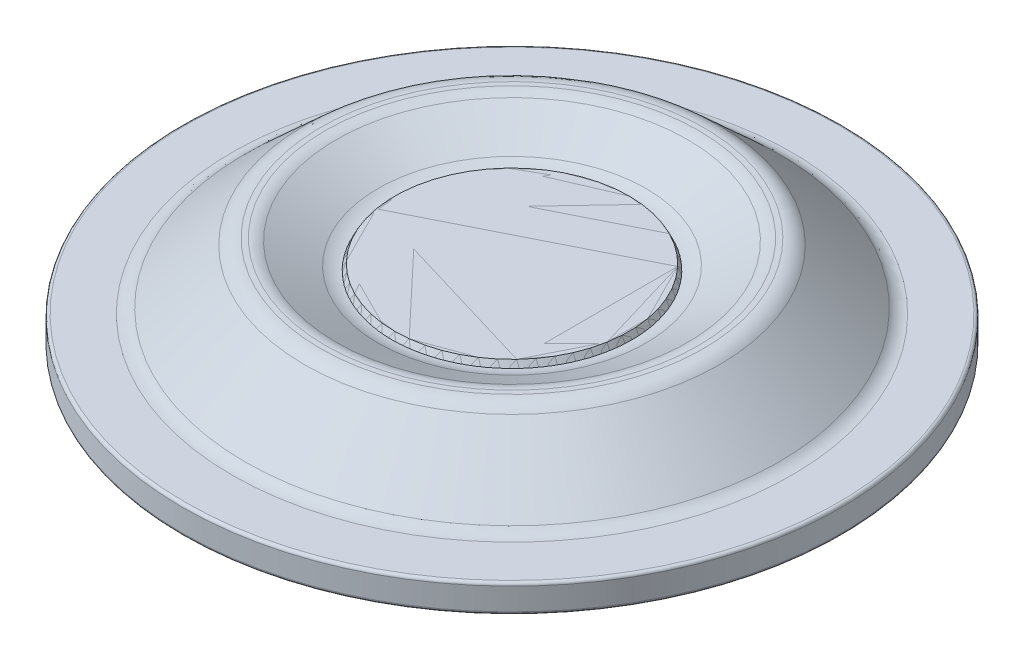
ISO-10303-21;
HEADER;
FILE_DESCRIPTION(('STEP AP214'),'2;1');
FILE_NAME('part.step','',(''),(''),'','','');
FILE_SCHEMA(('AUTOMOTIVE_DESIGN { 1 0 10303 214 1 1 1 1 }'));
ENDSEC;
DATA;
#1=APPLICATION_CONTEXT('core data for automotive mechanical design processes');
#2=APPLICATION_PROTOCOL_DEFINITION('international standard','automotive_design',2000,#1);
#3=PRODUCT_CONTEXT('',#1,'mechanical');
#4=PRODUCT('Part','Part','',(#3));
#5=PRODUCT_RELATED_PRODUCT_CATEGORY('part','',(#4));
#6=PRODUCT_DEFINITION_FORMATION('','',#4);
#7=PRODUCT_DEFINITION_CONTEXT('part definition',#1,'design');
#8=PRODUCT_DEFINITION('design','',#6,#7);
#9=PRODUCT_DEFINITION_SHAPE('','',#8);
#10=(LENGTH_UNIT() NAMED_UNIT(*) SI_UNIT(.MILLI.,.METRE.));
#11=(NAMED_UNIT(*) PLANE_ANGLE_UNIT() SI_UNIT($,.RADIAN.));
#12=(NAMED_UNIT(*) SI_UNIT($,.STERADIAN.) SOLID_ANGLE_UNIT());
#13=UNCERTAINTY_MEASURE_WITH_UNIT(LENGTH_MEASURE(1.E-05),#10,'distance_accuracy_value','');
#14=(GEOMETRIC_REPRESENTATION_CONTEXT(3) GLOBAL_UNCERTAINTY_ASSIGNED_CONTEXT((#13)) GLOBAL_UNIT_ASSIGNED_CONTEXT((#10,
#11,#12)) REPRESENTATION_CONTEXT('',''));
#15=CARTESIAN_POINT('',(0.,0.,0.));
#16=DIRECTION('',(0.,0.,1.));
#17=DIRECTION('',(1.,0.,0.));
#18=AXIS2_PLACEMENT_3D('',#15,#16,#17);
#19=CARTESIAN_POINT('',(0.,-4.8,0.));
#20=DIRECTION('',(0.,-1.,0.));
#21=DIRECTION('',(0.,0.,-1.));
#22=AXIS2_PLACEMENT_3D('',#19,#20,#21);
#23=CONICAL_SURFACE('',#22,20.5,0.463647609000806);
#24=CARTESIAN_POINT('',(0.,-3.8,0.));
#25=DIRECTION('',(0.,-1.,0.));
#26=DIRECTION('',(0.,0.,-1.));
#27=AXIS2_PLACEMENT_3D('',#24,#25,#26);
#28=CIRCLE('',#27,20.);
#29=CARTESIAN_POINT('',(0.,-3.8,-20.));
#30=VERTEX_POINT('',#29);
#31=EDGE_CURVE('E11',#30,#30,#28,.T.);
#32=ORIENTED_EDGE('',*,*,#31,.T.);
#33=EDGE_LOOP('',(#32));
#34=FACE_BOUND('',#33,.T.);
#35=CARTESIAN_POINT('',(0.,-4.8,0.));
#36=DIRECTION('',(0.,-1.,0.));
#37=DIRECTION('',(0.,0.,-1.));
#38=AXIS2_PLACEMENT_3D('',#35,#36,#37);
#39=CIRCLE('',#38,20.5);
#40=CARTESIAN_POINT('',(0.,-4.8,-20.5));
#41=VERTEX_POINT('',#40);
#42=EDGE_CURVE('E61',#41,#41,#39,.T.);
#43=ORIENTED_EDGE('',*,*,#42,.F.);
#44=EDGE_LOOP('',(#43));
#45=FACE_BOUND('',#44,.T.);
#46=ADVANCED_FACE('F51',(#34,#45),#23,.T.);
#47=CARTESIAN_POINT('',(20.,-3.8,0.));
#48=DIRECTION('',(0.,1.,0.));
#49=DIRECTION('',(0.,0.,1.));
#50=AXIS2_PLACEMENT_3D('',#47,#48,#49);
#51=PLANE('',#50);
#52=ORIENTED_EDGE('',*,*,#31,.F.);
#53=EDGE_LOOP('',(#52));
#54=FACE_BOUND('',#53,.T.);
#55=ADVANCED_FACE('F72',(#54),#51,.T.);
#56=CARTESIAN_POINT('',(14.084525296917,-5.4,0.));
#57=DIRECTION('',(0.,-1.,0.));
#58=DIRECTION('',(0.,0.,-1.));
#59=AXIS2_PLACEMENT_3D('',#56,#57,#58);
#60=PLANE('',#59);
#61=CARTESIAN_POINT('',(0.,-5.4,0.));
#62=DIRECTION('',(0.,-1.,0.));
#63=DIRECTION('',(0.,0.,-1.));
#64=AXIS2_PLACEMENT_3D('',#61,#62,#63);
#65=CIRCLE('',#64,14.084525296917);
#66=CARTESIAN_POINT('',(0.,-5.4,-14.084525296917));
#67=VERTEX_POINT('',#66);
#68=EDGE_CURVE('E57',#67,#67,#65,.T.);
#69=ORIENTED_EDGE('',*,*,#68,.T.);
#70=EDGE_LOOP('',(#69));
#71=FACE_BOUND('',#70,.T.);
#72=ADVANCED_FACE('F76',(#71),#60,.T.);
#73=CARTESIAN_POINT('',(0.,-5.4,0.));
#74=DIRECTION('',(0.,1.,0.));
#75=DIRECTION('',(0.,0.,1.));
#76=AXIS2_PLACEMENT_3D('',#73,#74,#75);
#77=CONICAL_SURFACE('',#76,14.084525296917,1.47754371360641);
#78=ORIENTED_EDGE('',*,*,#42,.T.);
#79=EDGE_LOOP('',(#78));
#80=FACE_BOUND('',#79,.T.);
#81=ORIENTED_EDGE('',*,*,#68,.F.);
#82=EDGE_LOOP('',(#81));
#83=FACE_BOUND('',#82,.T.);
#84=ADVANCED_FACE('F68',(#80,#83),#77,.T.);
#85=CLOSED_SHELL('',(#46,#55,#72,#84));
#86=MANIFOLD_SOLID_BREP('B2',#85);
#87=CARTESIAN_POINT('',(0.,1.67175831276235,0.));
#88=DIRECTION('',(0.,1.,0.));
#89=DIRECTION('',(0.,0.,1.));
#90=AXIS2_PLACEMENT_3D('',#87,#88,#89);
#91=TOROIDAL_SURFACE('',#90,19.8947361391993,6.5);
#92=CARTESIAN_POINT('',(0.,-4.8,0.));
#93=DIRECTION('',(0.,1.,0.));
#94=DIRECTION('',(0.,0.,1.));
#95=AXIS2_PLACEMENT_3D('',#92,#93,#94);
#96=CIRCLE('',#95,20.5);
#97=CARTESIAN_POINT('',(0.,-4.8,20.5));
#98=VERTEX_POINT('',#97);
#99=EDGE_CURVE('E50',#98,#98,#96,.T.);
#100=ORIENTED_EDGE('',*,*,#99,.F.);
#101=EDGE_LOOP('',(#100));
#102=FACE_BOUND('',#101,.T.);
#103=CARTESIAN_POINT('',(0.,-4.10695670028423,0.));
#104=DIRECTION('',(0.,1.,0.));
#105=DIRECTION('',(0.,0.,1.));
#106=AXIS2_PLACEMENT_3D('',#103,#104,#105);
#107=CIRCLE('',#106,22.8707154398649);
#108=CARTESIAN_POINT('',(0.,-4.10695670028423,22.8707154398649));
#109=VERTEX_POINT('',#108);
#110=EDGE_CURVE('E202',#109,#109,#107,.T.);
#111=ORIENTED_EDGE('',*,*,#110,.T.);
#112=EDGE_LOOP('',(#111));
#113=FACE_BOUND('',#112,.T.);
#114=ADVANCED_FACE('F107',(#102,#113),#91,.F.);
#115=CARTESIAN_POINT('',(0.,-4.8,0.));
#116=DIRECTION('',(0.,-1.,0.));
#117=DIRECTION('',(0.,0.,-1.));
#118=AXIS2_PLACEMENT_3D('',#115,#116,#117);
#119=CONICAL_SURFACE('',#118,20.5,0.463647609000806);
#120=CARTESIAN_POINT('',(0.,-3.8,0.));
#121=DIRECTION('',(0.,1.,0.));
#122=DIRECTION('',(0.,0.,1.));
#123=AXIS2_PLACEMENT_3D('',#120,#121,#122);
#124=CIRCLE('',#123,20.);
#125=CARTESIAN_POINT('',(0.,-3.8,20.));
#126=VERTEX_POINT('',#125);
#127=EDGE_CURVE('E114',#126,#126,#124,.T.);
#128=ORIENTED_EDGE('',*,*,#127,.F.);
#129=EDGE_LOOP('',(#128));
#130=FACE_BOUND('',#129,.T.);
#131=ORIENTED_EDGE('',*,*,#99,.T.);
#132=EDGE_LOOP('',(#131));
#133=FACE_BOUND('',#132,.T.);
#134=ADVANCED_FACE('F335',(#130,#133),#119,.T.);
#135=CARTESIAN_POINT('',(20.,-3.8,0.));
#136=DIRECTION('',(0.,-1.,0.));
#137=DIRECTION('',(0.,0.,-1.));
#138=AXIS2_PLACEMENT_3D('',#135,#136,#137);
#139=PLANE('',#138);
#140=ORIENTED_EDGE('',*,*,#127,.T.);
#141=EDGE_LOOP('',(#140));
#142=FACE_BOUND('',#141,.T.);
#143=ADVANCED_FACE('F330',(#142),#139,.F.);
#144=CARTESIAN_POINT('',(0.,-9.3,0.));
#145=DIRECTION('',(0.,1.,0.));
#146=DIRECTION('',(0.,0.,1.));
#147=AXIS2_PLACEMENT_3D('',#144,#145,#146);
#148=PLANE('',#147);
#149=CARTESIAN_POINT('',(0.,-9.3,0.));
#150=DIRECTION('',(0.,1.,0.));
#151=DIRECTION('',(0.,0.,1.));
#152=AXIS2_PLACEMENT_3D('',#149,#150,#151);
#153=CIRCLE('',#152,15.);
#154=CARTESIAN_POINT('',(0.,-9.3,15.));
#155=VERTEX_POINT('',#154);
#156=EDGE_CURVE('E119',#155,#155,#153,.T.);
#157=ORIENTED_EDGE('',*,*,#156,.F.);
#158=EDGE_LOOP('',(#157));
#159=FACE_BOUND('',#158,.T.);
#160=ADVANCED_FACE('F325',(#159),#148,.F.);
#161=CARTESIAN_POINT('',(0.,-3.11108849935529,0.));
#162=DIRECTION('',(0.,1.,0.));
#163=DIRECTION('',(0.,0.,1.));
#164=AXIS2_PLACEMENT_3D('',#161,#162,#163);
#165=TOROIDAL_SURFACE('',#164,15.,6.18891150064471);
#166=CARTESIAN_POINT('',(0.,-8.61323554600025,0.));
#167=DIRECTION('',(0.,1.,0.));
#168=DIRECTION('',(0.,0.,1.));
#169=AXIS2_PLACEMENT_3D('',#166,#167,#168);
#170=CIRCLE('',#169,17.8335496183954);
#171=CARTESIAN_POINT('',(0.,-8.61323554600025,17.8335496183954));
#172=VERTEX_POINT('',#171);
#173=EDGE_CURVE('E124',#172,#172,#170,.T.);
#174=ORIENTED_EDGE('',*,*,#173,.F.);
#175=EDGE_LOOP('',(#174));
#176=FACE_BOUND('',#175,.T.);
#177=ORIENTED_EDGE('',*,*,#156,.T.);
#178=EDGE_LOOP('',(#177));
#179=FACE_BOUND('',#178,.T.);
#180=ADVANCED_FACE('F319',(#176,#179),#165,.T.);
#181=CARTESIAN_POINT('',(0.,-8.61323554600025,0.));
#182=DIRECTION('',(0.,1.,0.));
#183=DIRECTION('',(0.,0.,1.));
#184=AXIS2_PLACEMENT_3D('',#181,#182,#183);
#185=CONICAL_SURFACE('',#184,17.8335496183954,1.09522891429881);
#186=CARTESIAN_POINT('',(0.,-2.36699558334569,0.));
#187=DIRECTION('',(0.,1.,0.));
#188=DIRECTION('',(0.,0.,1.));
#189=AXIS2_PLACEMENT_3D('',#186,#187,#188);
#190=CIRCLE('',#189,29.9624110789609);
#191=CARTESIAN_POINT('',(0.,-2.36699558334569,29.9624110789609));
#192=VERTEX_POINT('',#191);
#193=EDGE_CURVE('E130',#192,#192,#190,.T.);
#194=ORIENTED_EDGE('',*,*,#193,.F.);
#195=EDGE_LOOP('',(#194));
#196=FACE_BOUND('',#195,.T.);
#197=ORIENTED_EDGE('',*,*,#173,.T.);
#198=EDGE_LOOP('',(#197));
#199=FACE_BOUND('',#198,.T.);
#200=ADVANCED_FACE('F313',(#196,#199),#185,.T.);
#201=CARTESIAN_POINT('',(0.,-6.36764443853178,0.));
#202=DIRECTION('',(0.,1.,0.));
#203=DIRECTION('',(0.,0.,1.));
#204=AXIS2_PLACEMENT_3D('',#201,#202,#203);
#205=TOROIDAL_SURFACE('',#204,32.0227044409601,4.5);
#206=CARTESIAN_POINT('',(0.,-3.04927798009799,0.));
#207=DIRECTION('',(0.,1.,0.));
#208=DIRECTION('',(0.,0.,1.));
#209=AXIS2_PLACEMENT_3D('',#206,#207,#208);
#210=CIRCLE('',#209,35.0621853255096);
#211=CARTESIAN_POINT('',(0.,-3.04927798009799,35.0621853255096));
#212=VERTEX_POINT('',#211);
#213=EDGE_CURVE('E134',#212,#212,#210,.T.);
#214=ORIENTED_EDGE('',*,*,#213,.F.);
#215=EDGE_LOOP('',(#214));
#216=FACE_BOUND('',#215,.T.);
#217=ORIENTED_EDGE('',*,*,#193,.T.);
#218=EDGE_LOOP('',(#217));
#219=FACE_BOUND('',#218,.T.);
#220=ADVANCED_FACE('F307',(#216,#219),#205,.F.);
#221=CARTESIAN_POINT('',(0.,-3.04927798009799,0.));
#222=DIRECTION('',(0.,-1.,0.));
#223=DIRECTION('',(0.,0.,-1.));
#224=AXIS2_PLACEMENT_3D('',#221,#222,#223);
#225=CONICAL_SURFACE('',#224,35.0621853255096,0.82923484197698);
#226=CARTESIAN_POINT('',(0.,-11.4204663836744,0.));
#227=DIRECTION('',(0.,1.,0.));
#228=DIRECTION('',(0.,0.,1.));
#229=AXIS2_PLACEMENT_3D('',#226,#227,#228);
#230=CIRCLE('',#229,44.2014666274136);
#231=CARTESIAN_POINT('',(0.,-11.4204663836744,44.2014666274136));
#232=VERTEX_POINT('',#231);
#233=EDGE_CURVE('E138',#232,#232,#230,.T.);
#234=ORIENTED_EDGE('',*,*,#233,.F.);
#235=EDGE_LOOP('',(#234));
#236=FACE_BOUND('',#235,.T.);
#237=ORIENTED_EDGE('',*,*,#213,.T.);
#238=EDGE_LOOP('',(#237));
#239=FACE_BOUND('',#238,.T.);
#240=ADVANCED_FACE('F301',(#236,#239),#225,.F.);
#241=CARTESIAN_POINT('',(0.,-7.54633966023258,0.));
#242=DIRECTION('',(0.,1.,0.));
#243=DIRECTION('',(0.,0.,1.));
#244=AXIS2_PLACEMENT_3D('',#241,#242,#243);
#245=TOROIDAL_SURFACE('',#244,47.75,5.25366033976741);
#246=CARTESIAN_POINT('',(0.,-12.8,0.));
#247=DIRECTION('',(0.,1.,0.));
#248=DIRECTION('',(0.,0.,1.));
#249=AXIS2_PLACEMENT_3D('',#246,#247,#248);
#250=CIRCLE('',#249,47.75);
#251=CARTESIAN_POINT('',(0.,-12.8,47.75));
#252=VERTEX_POINT('',#251);
#253=EDGE_CURVE('E142',#252,#252,#250,.T.);
#254=ORIENTED_EDGE('',*,*,#253,.F.);
#255=EDGE_LOOP('',(#254));
#256=FACE_BOUND('',#255,.T.);
#257=ORIENTED_EDGE('',*,*,#233,.T.);
#258=EDGE_LOOP('',(#257));
#259=FACE_BOUND('',#258,.T.);
#260=ADVANCED_FACE('F295',(#256,#259),#245,.T.);
#261=CARTESIAN_POINT('',(51.,-12.8,0.));
#262=DIRECTION('',(0.,1.,0.));
#263=DIRECTION('',(0.,0.,1.));
#264=AXIS2_PLACEMENT_3D('',#261,#262,#263);
#265=PLANE('',#264);
#266=CARTESIAN_POINT('',(0.,-12.8,0.));
#267=DIRECTION('',(0.,1.,0.));
#268=DIRECTION('',(0.,0.,1.));
#269=AXIS2_PLACEMENT_3D('',#266,#267,#268);
#270=CIRCLE('',#269,51.);
#271=CARTESIAN_POINT('',(0.,-12.8,51.));
#272=VERTEX_POINT('',#271);
#273=EDGE_CURVE('E146',#272,#272,#270,.T.);
#274=ORIENTED_EDGE('',*,*,#273,.F.);
#275=EDGE_LOOP('',(#274));
#276=FACE_BOUND('',#275,.T.);
#277=ORIENTED_EDGE('',*,*,#253,.T.);
#278=EDGE_LOOP('',(#277));
#279=FACE_BOUND('',#278,.T.);
#280=ADVANCED_FACE('F289',(#276,#279),#265,.F.);
#281=CARTESIAN_POINT('',(0.,-13.3,0.));
#282=DIRECTION('',(0.,1.,0.));
#283=DIRECTION('',(0.,0.,1.));
#284=AXIS2_PLACEMENT_3D('',#281,#282,#283);
#285=TOROIDAL_SURFACE('',#284,51.,0.5);
#286=CARTESIAN_POINT('',(0.,-13.3,0.));
#287=DIRECTION('',(0.,1.,0.));
#288=DIRECTION('',(0.,0.,1.));
#289=AXIS2_PLACEMENT_3D('',#286,#287,#288);
#290=CIRCLE('',#289,51.5);
#291=CARTESIAN_POINT('',(0.,-13.3,51.5));
#292=VERTEX_POINT('',#291);
#293=EDGE_CURVE('E150',#292,#292,#290,.T.);
#294=ORIENTED_EDGE('',*,*,#293,.F.);
#295=EDGE_LOOP('',(#294));
#296=FACE_BOUND('',#295,.T.);
#297=ORIENTED_EDGE('',*,*,#273,.T.);
#298=EDGE_LOOP('',(#297));
#299=FACE_BOUND('',#298,.T.);
#300=ADVANCED_FACE('F283',(#296,#299),#285,.F.);
#301=CARTESIAN_POINT('',(0.,0.,0.));
#302=DIRECTION('',(0.,1.,0.));
#303=DIRECTION('',(0.,0.,1.));
#304=AXIS2_PLACEMENT_3D('',#301,#302,#303);
#305=CYLINDRICAL_SURFACE('',#304,51.5);
#306=CARTESIAN_POINT('',(0.,-15.25,0.));
#307=DIRECTION('',(0.,1.,0.));
#308=DIRECTION('',(0.,0.,1.));
#309=AXIS2_PLACEMENT_3D('',#306,#307,#308);
#310=CIRCLE('',#309,51.5);
#311=CARTESIAN_POINT('',(0.,-15.25,51.5));
#312=VERTEX_POINT('',#311);
#313=EDGE_CURVE('E154',#312,#312,#310,.T.);
#314=ORIENTED_EDGE('',*,*,#313,.F.);
#315=EDGE_LOOP('',(#314));
#316=FACE_BOUND('',#315,.T.);
#317=ORIENTED_EDGE('',*,*,#293,.T.);
#318=EDGE_LOOP('',(#317));
#319=FACE_BOUND('',#318,.T.);
#320=ADVANCED_FACE('F277',(#316,#319),#305,.F.);
#321=CARTESIAN_POINT('',(0.,-15.25,0.));
#322=DIRECTION('',(0.,1.,0.));
#323=DIRECTION('',(0.,0.,1.));
#324=AXIS2_PLACEMENT_3D('',#321,#322,#323);
#325=TOROIDAL_SURFACE('',#324,52.25,0.749999999999999);
#326=CARTESIAN_POINT('',(0.,-16.,0.));
#327=DIRECTION('',(0.,1.,0.));
#328=DIRECTION('',(0.,0.,1.));
#329=AXIS2_PLACEMENT_3D('',#326,#327,#328);
#330=CIRCLE('',#329,52.25);
#331=CARTESIAN_POINT('',(0.,-16.,52.25));
#332=VERTEX_POINT('',#331);
#333=EDGE_CURVE('E158',#332,#332,#330,.T.);
#334=ORIENTED_EDGE('',*,*,#333,.F.);
#335=EDGE_LOOP('',(#334));
#336=FACE_BOUND('',#335,.T.);
#337=ORIENTED_EDGE('',*,*,#313,.T.);
#338=EDGE_LOOP('',(#337));
#339=FACE_BOUND('',#338,.T.);
#340=ADVANCED_FACE('F271',(#336,#339),#325,.T.);
#341=CARTESIAN_POINT('',(55.75,-16.,0.));
#342=DIRECTION('',(0.,1.,0.));
#343=DIRECTION('',(0.,0.,1.));
#344=AXIS2_PLACEMENT_3D('',#341,#342,#343);
#345=PLANE('',#344);
#346=CARTESIAN_POINT('',(0.,-16.,0.));
#347=DIRECTION('',(0.,1.,0.));
#348=DIRECTION('',(0.,0.,1.));
#349=AXIS2_PLACEMENT_3D('',#346,#347,#348);
#350=CIRCLE('',#349,55.75);
#351=CARTESIAN_POINT('',(0.,-16.,55.75));
#352=VERTEX_POINT('',#351);
#353=EDGE_CURVE('E162',#352,#352,#350,.T.);
#354=ORIENTED_EDGE('',*,*,#353,.F.);
#355=EDGE_LOOP('',(#354));
#356=FACE_BOUND('',#355,.T.);
#357=ORIENTED_EDGE('',*,*,#333,.T.);
#358=EDGE_LOOP('',(#357));
#359=FACE_BOUND('',#358,.T.);
#360=ADVANCED_FACE('F265',(#356,#359),#345,.F.);
#361=CARTESIAN_POINT('',(0.,-15.5,0.));
#362=DIRECTION('',(0.,1.,0.));
#363=DIRECTION('',(0.,0.,1.));
#364=AXIS2_PLACEMENT_3D('',#361,#362,#363);
#365=TOROIDAL_SURFACE('',#364,55.75,0.500000000000006);
#366=CARTESIAN_POINT('',(0.,-15.5,0.));
#367=DIRECTION('',(0.,1.,0.));
#368=DIRECTION('',(0.,0.,1.));
#369=AXIS2_PLACEMENT_3D('',#366,#367,#368);
#370=CIRCLE('',#369,56.25);
#371=CARTESIAN_POINT('',(0.,-15.5,56.25));
#372=VERTEX_POINT('',#371);
#373=EDGE_CURVE('E166',#372,#372,#370,.T.);
#374=ORIENTED_EDGE('',*,*,#373,.F.);
#375=EDGE_LOOP('',(#374));
#376=FACE_BOUND('',#375,.T.);
#377=ORIENTED_EDGE('',*,*,#353,.T.);
#378=EDGE_LOOP('',(#377));
#379=FACE_BOUND('',#378,.T.);
#380=ADVANCED_FACE('F259',(#376,#379),#365,.T.);
#381=CARTESIAN_POINT('',(0.,0.,0.));
#382=DIRECTION('',(0.,1.,0.));
#383=DIRECTION('',(0.,0.,1.));
#384=AXIS2_PLACEMENT_3D('',#381,#382,#383);
#385=CYLINDRICAL_SURFACE('',#384,56.25);
#386=CARTESIAN_POINT('',(0.,-11.7,0.));
#387=DIRECTION('',(0.,1.,0.));
#388=DIRECTION('',(0.,0.,1.));
#389=AXIS2_PLACEMENT_3D('',#386,#387,#388);
#390=CIRCLE('',#389,56.25);
#391=CARTESIAN_POINT('',(0.,-11.7,56.25));
#392=VERTEX_POINT('',#391);
#393=EDGE_CURVE('E170',#392,#392,#390,.T.);
#394=ORIENTED_EDGE('',*,*,#393,.F.);
#395=EDGE_LOOP('',(#394));
#396=FACE_BOUND('',#395,.T.);
#397=ORIENTED_EDGE('',*,*,#373,.T.);
#398=EDGE_LOOP('',(#397));
#399=FACE_BOUND('',#398,.T.);
#400=ADVANCED_FACE('F253',(#396,#399),#385,.T.);
#401=CARTESIAN_POINT('',(0.,-11.7,0.));
#402=DIRECTION('',(0.,1.,0.));
#403=DIRECTION('',(0.,0.,1.));
#404=AXIS2_PLACEMENT_3D('',#401,#402,#403);
#405=TOROIDAL_SURFACE('',#404,55.75,0.500000000000004);
#406=CARTESIAN_POINT('',(0.,-11.2,0.));
#407=DIRECTION('',(0.,1.,0.));
#408=DIRECTION('',(0.,0.,1.));
#409=AXIS2_PLACEMENT_3D('',#406,#407,#408);
#410=CIRCLE('',#409,55.75);
#411=CARTESIAN_POINT('',(0.,-11.2,55.75));
#412=VERTEX_POINT('',#411);
#413=EDGE_CURVE('E174',#412,#412,#410,.T.);
#414=ORIENTED_EDGE('',*,*,#413,.F.);
#415=EDGE_LOOP('',(#414));
#416=FACE_BOUND('',#415,.T.);
#417=ORIENTED_EDGE('',*,*,#393,.T.);
#418=EDGE_LOOP('',(#417));
#419=FACE_BOUND('',#418,.T.);
#420=ADVANCED_FACE('F247',(#416,#419),#405,.T.);
#421=CARTESIAN_POINT('',(47.75,-11.2,0.));
#422=DIRECTION('',(0.,-1.,0.));
#423=DIRECTION('',(0.,0.,-1.));
#424=AXIS2_PLACEMENT_3D('',#421,#422,#423);
#425=PLANE('',#424);
#426=CARTESIAN_POINT('',(0.,-11.2,0.));
#427=DIRECTION('',(0.,1.,0.));
#428=DIRECTION('',(0.,0.,1.));
#429=AXIS2_PLACEMENT_3D('',#426,#427,#428);
#430=CIRCLE('',#429,47.75);
#431=CARTESIAN_POINT('',(0.,-11.2,47.75));
#432=VERTEX_POINT('',#431);
#433=EDGE_CURVE('E178',#432,#432,#430,.T.);
#434=ORIENTED_EDGE('',*,*,#433,.F.);
#435=EDGE_LOOP('',(#434));
#436=FACE_BOUND('',#435,.T.);
#437=ORIENTED_EDGE('',*,*,#413,.T.);
#438=EDGE_LOOP('',(#437));
#439=FACE_BOUND('',#438,.T.);
#440=ADVANCED_FACE('F241',(#436,#439),#425,.F.);
#441=CARTESIAN_POINT('',(0.,-7.92716838942009,0.));
#442=DIRECTION('',(0.,1.,0.));
#443=DIRECTION('',(0.,0.,1.));
#444=AXIS2_PLACEMENT_3D('',#441,#442,#443);
#445=TOROIDAL_SURFACE('',#444,47.75,3.2728316105799);
#446=CARTESIAN_POINT('',(0.,-10.340602754009,0.));
#447=DIRECTION('',(0.,1.,0.));
#448=DIRECTION('',(0.,0.,1.));
#449=AXIS2_PLACEMENT_3D('',#446,#447,#448);
#450=CIRCLE('',#449,45.5393979736207);
#451=CARTESIAN_POINT('',(0.,-10.340602754009,45.5393979736207));
#452=VERTEX_POINT('',#451);
#453=EDGE_CURVE('E182',#452,#452,#450,.T.);
#454=ORIENTED_EDGE('',*,*,#453,.F.);
#455=EDGE_LOOP('',(#454));
#456=FACE_BOUND('',#455,.T.);
#457=ORIENTED_EDGE('',*,*,#433,.T.);
#458=EDGE_LOOP('',(#457));
#459=FACE_BOUND('',#458,.T.);
#460=ADVANCED_FACE('F235',(#456,#459),#445,.F.);
#461=CARTESIAN_POINT('',(0.,-10.340602754009,0.));
#462=DIRECTION('',(0.,-1.,0.));
#463=DIRECTION('',(0.,0.,-1.));
#464=AXIS2_PLACEMENT_3D('',#461,#462,#463);
#465=CONICAL_SURFACE('',#464,45.5393979736207,0.82923484197698);
#466=CARTESIAN_POINT('',(0.,-1.05034092583663,0.));
#467=DIRECTION('',(0.,1.,0.));
#468=DIRECTION('',(0.,0.,1.));
#469=AXIS2_PLACEMENT_3D('',#466,#467,#468);
#470=CIRCLE('',#469,35.3967142681943);
#471=CARTESIAN_POINT('',(0.,-1.05034092583663,35.3967142681943));
#472=VERTEX_POINT('',#471);
#473=EDGE_CURVE('E186',#472,#472,#470,.T.);
#474=ORIENTED_EDGE('',*,*,#473,.F.);
#475=EDGE_LOOP('',(#474));
#476=FACE_BOUND('',#475,.T.);
#477=ORIENTED_EDGE('',*,*,#453,.T.);
#478=EDGE_LOOP('',(#477));
#479=FACE_BOUND('',#478,.T.);
#480=ADVANCED_FACE('F229',(#476,#479),#465,.T.);
#481=CARTESIAN_POINT('',(0.,-4.,0.));
#482=DIRECTION('',(0.,1.,0.));
#483=DIRECTION('',(0.,0.,1.));
#484=AXIS2_PLACEMENT_3D('',#481,#482,#483);
#485=TOROIDAL_SURFACE('',#484,32.6949534819281,4.);
#486=CARTESIAN_POINT('',(0.,0.,0.));
#487=DIRECTION('',(0.,1.,0.));
#488=DIRECTION('',(0.,0.,1.));
#489=AXIS2_PLACEMENT_3D('',#486,#487,#488);
#490=CIRCLE('',#489,32.6949534819281);
#491=CARTESIAN_POINT('',(0.,0.,32.6949534819281));
#492=VERTEX_POINT('',#491);
#493=EDGE_CURVE('E190',#492,#492,#490,.T.);
#494=ORIENTED_EDGE('',*,*,#493,.F.);
#495=EDGE_LOOP('',(#494));
#496=FACE_BOUND('',#495,.T.);
#497=ORIENTED_EDGE('',*,*,#473,.T.);
#498=EDGE_LOOP('',(#497));
#499=FACE_BOUND('',#498,.T.);
#500=ADVANCED_FACE('F223',(#496,#499),#485,.T.);
#501=CARTESIAN_POINT('',(32.6949534819281,0.,0.));
#502=DIRECTION('',(0.,-1.,0.));
#503=DIRECTION('',(0.,0.,-1.));
#504=AXIS2_PLACEMENT_3D('',#501,#502,#503);
#505=PLANE('',#504);
#506=CARTESIAN_POINT('',(0.,0.,0.));
#507=DIRECTION('',(0.,1.,0.));
#508=DIRECTION('',(0.,0.,1.));
#509=AXIS2_PLACEMENT_3D('',#506,#507,#508);
#510=CIRCLE('',#509,31.8150223722838);
#511=CARTESIAN_POINT('',(0.,0.,31.8150223722838));
#512=VERTEX_POINT('',#511);
#513=EDGE_CURVE('E194',#512,#512,#510,.T.);
#514=ORIENTED_EDGE('',*,*,#513,.F.);
#515=EDGE_LOOP('',(#514));
#516=FACE_BOUND('',#515,.T.);
#517=ORIENTED_EDGE('',*,*,#493,.T.);
#518=EDGE_LOOP('',(#517));
#519=FACE_BOUND('',#518,.T.);
#520=ADVANCED_FACE('F217',(#516,#519),#505,.F.);
#521=CARTESIAN_POINT('',(0.,-4.,0.));
#522=DIRECTION('',(0.,1.,0.));
#523=DIRECTION('',(0.,0.,1.));
#524=AXIS2_PLACEMENT_3D('',#521,#522,#523);
#525=TOROIDAL_SURFACE('',#524,31.8150223722838,4.);
#526=CARTESIAN_POINT('',(0.,-0.443867684279027,0.));
#527=DIRECTION('',(0.,1.,0.));
#528=DIRECTION('',(0.,0.,1.));
#529=AXIS2_PLACEMENT_3D('',#526,#527,#528);
#530=CIRCLE('',#529,29.9836504949511);
#531=CARTESIAN_POINT('',(0.,-0.443867684279027,29.9836504949511));
#532=VERTEX_POINT('',#531);
#533=EDGE_CURVE('E198',#532,#532,#530,.T.);
#534=ORIENTED_EDGE('',*,*,#533,.F.);
#535=EDGE_LOOP('',(#534));
#536=FACE_BOUND('',#535,.T.);
#537=ORIENTED_EDGE('',*,*,#513,.T.);
#538=EDGE_LOOP('',(#537));
#539=FACE_BOUND('',#538,.T.);
#540=ADVANCED_FACE('F211',(#536,#539),#525,.T.);
#541=CARTESIAN_POINT('',(0.,-0.443867684279027,0.));
#542=DIRECTION('',(0.,1.,0.));
#543=DIRECTION('',(0.,0.,1.));
#544=AXIS2_PLACEMENT_3D('',#541,#542,#543);
#545=CONICAL_SURFACE('',#544,29.9836504949511,1.09522891429881);
#546=ORIENTED_EDGE('',*,*,#110,.F.);
#547=EDGE_LOOP('',(#546));
#548=FACE_BOUND('',#547,.T.);
#549=ORIENTED_EDGE('',*,*,#533,.T.);
#550=EDGE_LOOP('',(#549));
#551=FACE_BOUND('',#550,.T.);
#552=ADVANCED_FACE('F208',(#548,#551),#545,.F.);
#553=CLOSED_SHELL('',(#114,#134,#143,#160,#180,#200,#220,#240,#260,#280,#300,#320,#340,#360,
#380,#400,#420,#440,#460,#480,#500,#520,#540,#552));
#554=MANIFOLD_SOLID_BREP('B6',#553);
#555=ADVANCED_BREP_SHAPE_REPRESENTATION('',(#18,#86,#554),#14);
#556=SHAPE_DEFINITION_REPRESENTATION(#9,#555);
ENDSEC;
END-ISO-10303-21;
